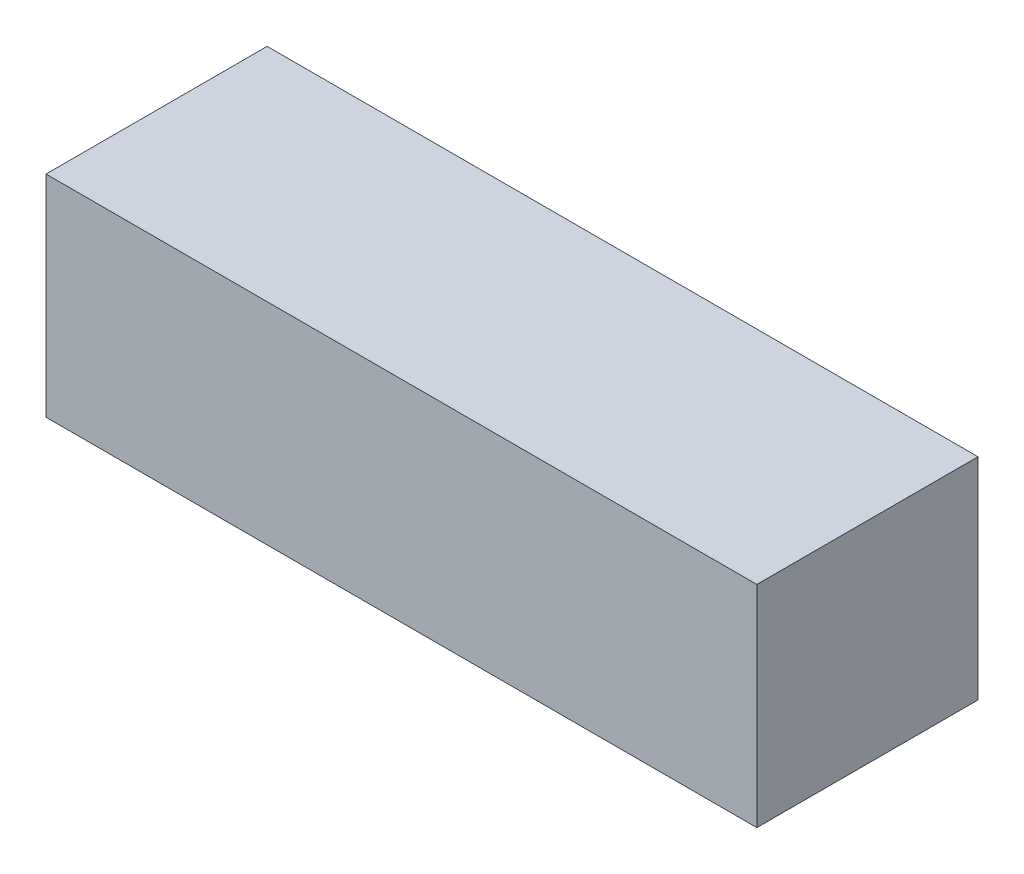
ISO-10303-21;
HEADER;
FILE_DESCRIPTION(('STEP AP214'),'2;1');
FILE_NAME('part.step','',(''),(''),'','','');
FILE_SCHEMA(('AUTOMOTIVE_DESIGN { 1 0 10303 214 1 1 1 1 }'));
ENDSEC;
DATA;
#1=APPLICATION_CONTEXT('core data for automotive mechanical design processes');
#2=APPLICATION_PROTOCOL_DEFINITION('international standard','automotive_design',2000,#1);
#3=PRODUCT_CONTEXT('',#1,'mechanical');
#4=PRODUCT('Part','Part','',(#3));
#5=PRODUCT_RELATED_PRODUCT_CATEGORY('part','',(#4));
#6=PRODUCT_DEFINITION_FORMATION('','',#4);
#7=PRODUCT_DEFINITION_CONTEXT('part definition',#1,'design');
#8=PRODUCT_DEFINITION('design','',#6,#7);
#9=PRODUCT_DEFINITION_SHAPE('','',#8);
#10=(LENGTH_UNIT() NAMED_UNIT(*) SI_UNIT(.MILLI.,.METRE.));
#11=(NAMED_UNIT(*) PLANE_ANGLE_UNIT() SI_UNIT($,.RADIAN.));
#12=(NAMED_UNIT(*) SI_UNIT($,.STERADIAN.) SOLID_ANGLE_UNIT());
#13=UNCERTAINTY_MEASURE_WITH_UNIT(LENGTH_MEASURE(1.E-05),#10,'distance_accuracy_value','');
#14=(GEOMETRIC_REPRESENTATION_CONTEXT(3) GLOBAL_UNCERTAINTY_ASSIGNED_CONTEXT((#13)) GLOBAL_UNIT_ASSIGNED_CONTEXT((#10,
#11,#12)) REPRESENTATION_CONTEXT('',''));
#15=CARTESIAN_POINT('',(0.,0.,0.));
#16=DIRECTION('',(0.,0.,1.));
#17=DIRECTION('',(1.,0.,0.));
#18=AXIS2_PLACEMENT_3D('',#15,#16,#17);
#19=CARTESIAN_POINT('',(-67.5,40.,21.));
#20=DIRECTION('',(1.,0.,0.));
#21=DIRECTION('',(0.,0.,-1.));
#22=AXIS2_PLACEMENT_3D('',#19,#20,#21);
#23=PLANE('',#22);
#24=DIRECTION('',(0.,0.,1.));
#25=VECTOR('',#24,1.);
#26=CARTESIAN_POINT('',(-67.5,0.,21.));
#27=LINE('',#26,#25);
#28=CARTESIAN_POINT('',(-67.5,0.,-21.));
#29=VERTEX_POINT('',#28);
#30=CARTESIAN_POINT('',(-67.5,0.,21.));
#31=VERTEX_POINT('',#30);
#32=EDGE_CURVE('E95',#29,#31,#27,.T.);
#33=ORIENTED_EDGE('',*,*,#32,.T.);
#34=DIRECTION('',(0.,-1.,0.));
#35=VECTOR('',#34,1.);
#36=CARTESIAN_POINT('',(-67.5,40.,21.));
#37=LINE('',#36,#35);
#38=CARTESIAN_POINT('',(-67.5,40.,21.));
#39=VERTEX_POINT('',#38);
#40=EDGE_CURVE('E11',#39,#31,#37,.T.);
#41=ORIENTED_EDGE('',*,*,#40,.F.);
#42=DIRECTION('',(0.,0.,1.));
#43=VECTOR('',#42,1.);
#44=CARTESIAN_POINT('',(-67.5,40.,21.));
#45=LINE('',#44,#43);
#46=CARTESIAN_POINT('',(-67.5,40.,-21.));
#47=VERTEX_POINT('',#46);
#48=EDGE_CURVE('E83',#47,#39,#45,.T.);
#49=ORIENTED_EDGE('',*,*,#48,.F.);
#50=DIRECTION('',(0.,-1.,0.));
#51=VECTOR('',#50,1.);
#52=CARTESIAN_POINT('',(-67.5,40.,-21.));
#53=LINE('',#52,#51);
#54=EDGE_CURVE('E91',#47,#29,#53,.T.);
#55=ORIENTED_EDGE('',*,*,#54,.T.);
#56=EDGE_LOOP('',(#33,#41,#49,#55));
#57=FACE_BOUND('',#56,.T.);
#58=ADVANCED_FACE('F32',(#57),#23,.F.);
#59=CARTESIAN_POINT('',(67.5,40.,21.));
#60=DIRECTION('',(0.,0.,-1.));
#61=DIRECTION('',(-1.,0.,0.));
#62=AXIS2_PLACEMENT_3D('',#59,#60,#61);
#63=PLANE('',#62);
#64=DIRECTION('',(1.,0.,0.));
#65=VECTOR('',#64,1.);
#66=CARTESIAN_POINT('',(67.5,0.,21.));
#67=LINE('',#66,#65);
#68=CARTESIAN_POINT('',(67.5,0.,21.));
#69=VERTEX_POINT('',#68);
#70=EDGE_CURVE('E87',#31,#69,#67,.T.);
#71=ORIENTED_EDGE('',*,*,#70,.T.);
#72=DIRECTION('',(0.,-1.,0.));
#73=VECTOR('',#72,1.);
#74=CARTESIAN_POINT('',(67.5,40.,21.));
#75=LINE('',#74,#73);
#76=CARTESIAN_POINT('',(67.5,40.,21.));
#77=VERTEX_POINT('',#76);
#78=EDGE_CURVE('E40',#77,#69,#75,.T.);
#79=ORIENTED_EDGE('',*,*,#78,.F.);
#80=DIRECTION('',(1.,0.,0.));
#81=VECTOR('',#80,1.);
#82=CARTESIAN_POINT('',(67.5,40.,21.));
#83=LINE('',#82,#81);
#84=EDGE_CURVE('E78',#39,#77,#83,.T.);
#85=ORIENTED_EDGE('',*,*,#84,.F.);
#86=ORIENTED_EDGE('',*,*,#40,.T.);
#87=EDGE_LOOP('',(#71,#79,#85,#86));
#88=FACE_BOUND('',#87,.T.);
#89=ADVANCED_FACE('F86',(#88),#63,.F.);
#90=CARTESIAN_POINT('',(67.5,40.,21.));
#91=DIRECTION('',(-1.,0.,0.));
#92=DIRECTION('',(0.,0.,1.));
#93=AXIS2_PLACEMENT_3D('',#90,#91,#92);
#94=PLANE('',#93);
#95=DIRECTION('',(0.,0.,-1.));
#96=VECTOR('',#95,1.);
#97=CARTESIAN_POINT('',(67.5,0.,21.));
#98=LINE('',#97,#96);
#99=CARTESIAN_POINT('',(67.5,0.,-21.));
#100=VERTEX_POINT('',#99);
#101=EDGE_CURVE('E65',#69,#100,#98,.T.);
#102=ORIENTED_EDGE('',*,*,#101,.T.);
#103=DIRECTION('',(0.,-1.,0.));
#104=VECTOR('',#103,1.);
#105=CARTESIAN_POINT('',(67.5,40.,-21.));
#106=LINE('',#105,#104);
#107=CARTESIAN_POINT('',(67.5,40.,-21.));
#108=VERTEX_POINT('',#107);
#109=EDGE_CURVE('E88',#108,#100,#106,.T.);
#110=ORIENTED_EDGE('',*,*,#109,.F.);
#111=DIRECTION('',(0.,0.,-1.));
#112=VECTOR('',#111,1.);
#113=CARTESIAN_POINT('',(67.5,40.,21.));
#114=LINE('',#113,#112);
#115=EDGE_CURVE('E81',#77,#108,#114,.T.);
#116=ORIENTED_EDGE('',*,*,#115,.F.);
#117=ORIENTED_EDGE('',*,*,#78,.T.);
#118=EDGE_LOOP('',(#102,#110,#116,#117));
#119=FACE_BOUND('',#118,.T.);
#120=ADVANCED_FACE('F89',(#119),#94,.F.);
#121=CARTESIAN_POINT('',(67.5,40.,-21.));
#122=DIRECTION('',(0.,0.,1.));
#123=DIRECTION('',(1.,0.,0.));
#124=AXIS2_PLACEMENT_3D('',#121,#122,#123);
#125=PLANE('',#124);
#126=DIRECTION('',(-1.,0.,0.));
#127=VECTOR('',#126,1.);
#128=CARTESIAN_POINT('',(67.5,0.,-21.));
#129=LINE('',#128,#127);
#130=EDGE_CURVE('E71',#100,#29,#129,.T.);
#131=ORIENTED_EDGE('',*,*,#130,.T.);
#132=ORIENTED_EDGE('',*,*,#54,.F.);
#133=DIRECTION('',(-1.,0.,0.));
#134=VECTOR('',#133,1.);
#135=CARTESIAN_POINT('',(67.5,40.,-21.));
#136=LINE('',#135,#134);
#137=EDGE_CURVE('E48',#108,#47,#136,.T.);
#138=ORIENTED_EDGE('',*,*,#137,.F.);
#139=ORIENTED_EDGE('',*,*,#109,.T.);
#140=EDGE_LOOP('',(#131,#132,#138,#139));
#141=FACE_BOUND('',#140,.T.);
#142=ADVANCED_FACE('F102',(#141),#125,.F.);
#143=CARTESIAN_POINT('',(0.,40.,0.));
#144=DIRECTION('',(0.,1.,0.));
#145=DIRECTION('',(0.,0.,1.));
#146=AXIS2_PLACEMENT_3D('',#143,#144,#145);
#147=PLANE('',#146);
#148=ORIENTED_EDGE('',*,*,#48,.T.);
#149=ORIENTED_EDGE('',*,*,#84,.T.);
#150=ORIENTED_EDGE('',*,*,#115,.T.);
#151=ORIENTED_EDGE('',*,*,#137,.T.);
#152=EDGE_LOOP('',(#148,#149,#150,#151));
#153=FACE_BOUND('',#152,.T.);
#154=ADVANCED_FACE('F79',(#153),#147,.T.);
#155=CARTESIAN_POINT('',(0.,0.,0.));
#156=DIRECTION('',(0.,1.,0.));
#157=DIRECTION('',(0.,0.,1.));
#158=AXIS2_PLACEMENT_3D('',#155,#156,#157);
#159=PLANE('',#158);
#160=ORIENTED_EDGE('',*,*,#32,.F.);
#161=ORIENTED_EDGE('',*,*,#130,.F.);
#162=ORIENTED_EDGE('',*,*,#101,.F.);
#163=ORIENTED_EDGE('',*,*,#70,.F.);
#164=EDGE_LOOP('',(#160,#161,#162,#163));
#165=FACE_BOUND('',#164,.T.);
#166=ADVANCED_FACE('F105',(#165),#159,.F.);
#167=CLOSED_SHELL('',(#58,#89,#120,#142,#154,#166));
#168=MANIFOLD_SOLID_BREP('B2',#167);
#169=ADVANCED_BREP_SHAPE_REPRESENTATION('',(#18,#168),#14);
#170=SHAPE_DEFINITION_REPRESENTATION(#9,#169);
ENDSEC;
END-ISO-10303-21;
